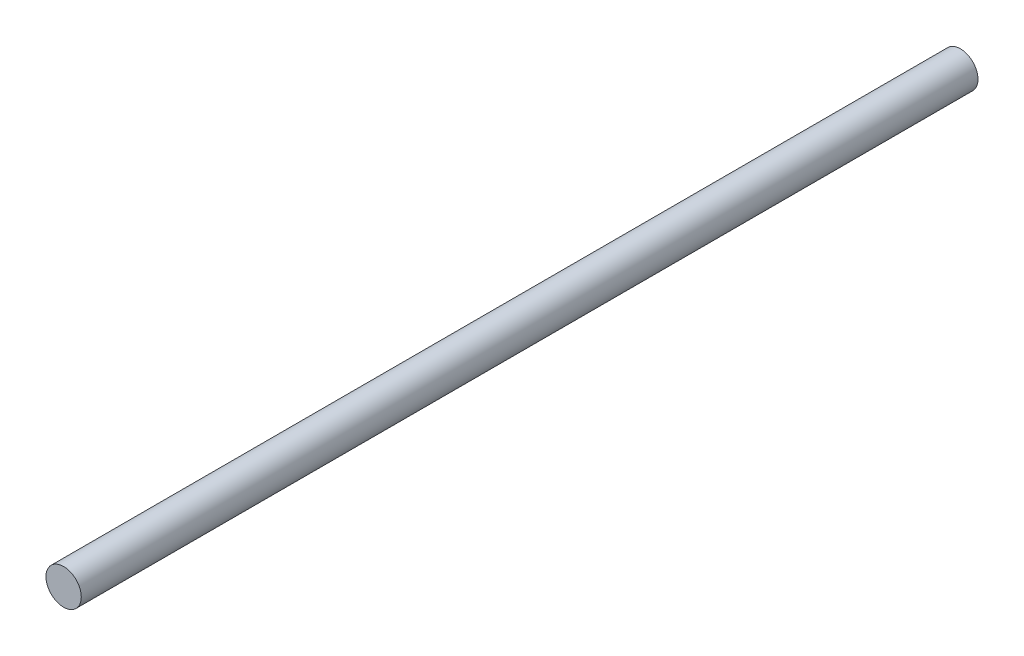
ISO-10303-21;
HEADER;
FILE_DESCRIPTION(('STEP AP214'),'2;1');
FILE_NAME('part.step','',(''),(''),'','','');
FILE_SCHEMA(('AUTOMOTIVE_DESIGN { 1 0 10303 214 1 1 1 1 }'));
ENDSEC;
DATA;
#1=APPLICATION_CONTEXT('core data for automotive mechanical design processes');
#2=APPLICATION_PROTOCOL_DEFINITION('international standard','automotive_design',2000,#1);
#3=PRODUCT_CONTEXT('',#1,'mechanical');
#4=PRODUCT('Part','Part','',(#3));
#5=PRODUCT_RELATED_PRODUCT_CATEGORY('part','',(#4));
#6=PRODUCT_DEFINITION_FORMATION('','',#4);
#7=PRODUCT_DEFINITION_CONTEXT('part definition',#1,'design');
#8=PRODUCT_DEFINITION('design','',#6,#7);
#9=PRODUCT_DEFINITION_SHAPE('','',#8);
#10=(LENGTH_UNIT() NAMED_UNIT(*) SI_UNIT(.MILLI.,.METRE.));
#11=(NAMED_UNIT(*) PLANE_ANGLE_UNIT() SI_UNIT($,.RADIAN.));
#12=(NAMED_UNIT(*) SI_UNIT($,.STERADIAN.) SOLID_ANGLE_UNIT());
#13=UNCERTAINTY_MEASURE_WITH_UNIT(LENGTH_MEASURE(1.E-05),#10,'distance_accuracy_value','');
#14=(GEOMETRIC_REPRESENTATION_CONTEXT(3) GLOBAL_UNCERTAINTY_ASSIGNED_CONTEXT((#13)) GLOBAL_UNIT_ASSIGNED_CONTEXT((#10,
#11,#12)) REPRESENTATION_CONTEXT('',''));
#15=CARTESIAN_POINT('',(0.,0.,0.));
#16=DIRECTION('',(0.,0.,1.));
#17=DIRECTION('',(1.,0.,0.));
#18=AXIS2_PLACEMENT_3D('',#15,#16,#17);
#19=CARTESIAN_POINT('',(-4.34381425096052,65.5621711828784,-64.));
#20=DIRECTION('',(0.,0.,1.));
#21=DIRECTION('',(1.,0.,0.));
#22=AXIS2_PLACEMENT_3D('',#19,#20,#21);
#23=CYLINDRICAL_SURFACE('',#22,1.25996085597728);
#24=CARTESIAN_POINT('',(-4.34381425096052,65.5621711828784,-64.));
#25=DIRECTION('',(0.,0.,1.));
#26=DIRECTION('',(1.,0.,0.));
#27=AXIS2_PLACEMENT_3D('',#24,#25,#26);
#28=CIRCLE('',#27,1.25996085597728);
#29=CARTESIAN_POINT('',(-3.08385339498324,65.5621711828784,-64.));
#30=VERTEX_POINT('',#29);
#31=EDGE_CURVE('E10',#30,#30,#28,.T.);
#32=ORIENTED_EDGE('',*,*,#31,.T.);
#33=EDGE_LOOP('',(#32));
#34=FACE_BOUND('',#33,.T.);
#35=CARTESIAN_POINT('',(-4.34381425096052,65.5621711828784,0.));
#36=DIRECTION('',(0.,0.,1.));
#37=DIRECTION('',(1.,0.,0.));
#38=AXIS2_PLACEMENT_3D('',#35,#36,#37);
#39=CIRCLE('',#38,1.25996085597728);
#40=CARTESIAN_POINT('',(-3.08385339498324,65.5621711828784,0.));
#41=VERTEX_POINT('',#40);
#42=EDGE_CURVE('E37',#41,#41,#39,.T.);
#43=ORIENTED_EDGE('',*,*,#42,.F.);
#44=EDGE_LOOP('',(#43));
#45=FACE_BOUND('',#44,.T.);
#46=ADVANCED_FACE('F31',(#34,#45),#23,.T.);
#47=CARTESIAN_POINT('',(-4.34381425096052,65.5621711828784,-64.));
#48=DIRECTION('',(0.,0.,1.));
#49=DIRECTION('',(1.,0.,0.));
#50=AXIS2_PLACEMENT_3D('',#47,#48,#49);
#51=PLANE('',#50);
#52=ORIENTED_EDGE('',*,*,#31,.F.);
#53=EDGE_LOOP('',(#52));
#54=FACE_BOUND('',#53,.T.);
#55=ADVANCED_FACE('F46',(#54),#51,.F.);
#56=CARTESIAN_POINT('',(-4.34381425096052,65.5621711828784,0.));
#57=DIRECTION('',(0.,0.,1.));
#58=DIRECTION('',(1.,0.,0.));
#59=AXIS2_PLACEMENT_3D('',#56,#57,#58);
#60=PLANE('',#59);
#61=ORIENTED_EDGE('',*,*,#42,.T.);
#62=EDGE_LOOP('',(#61));
#63=FACE_BOUND('',#62,.T.);
#64=ADVANCED_FACE('F43',(#63),#60,.T.);
#65=CLOSED_SHELL('',(#46,#55,#64));
#66=MANIFOLD_SOLID_BREP('B2',#65);
#67=ADVANCED_BREP_SHAPE_REPRESENTATION('',(#18,#66),#14);
#68=SHAPE_DEFINITION_REPRESENTATION(#9,#67);
ENDSEC;
END-ISO-10303-21;
